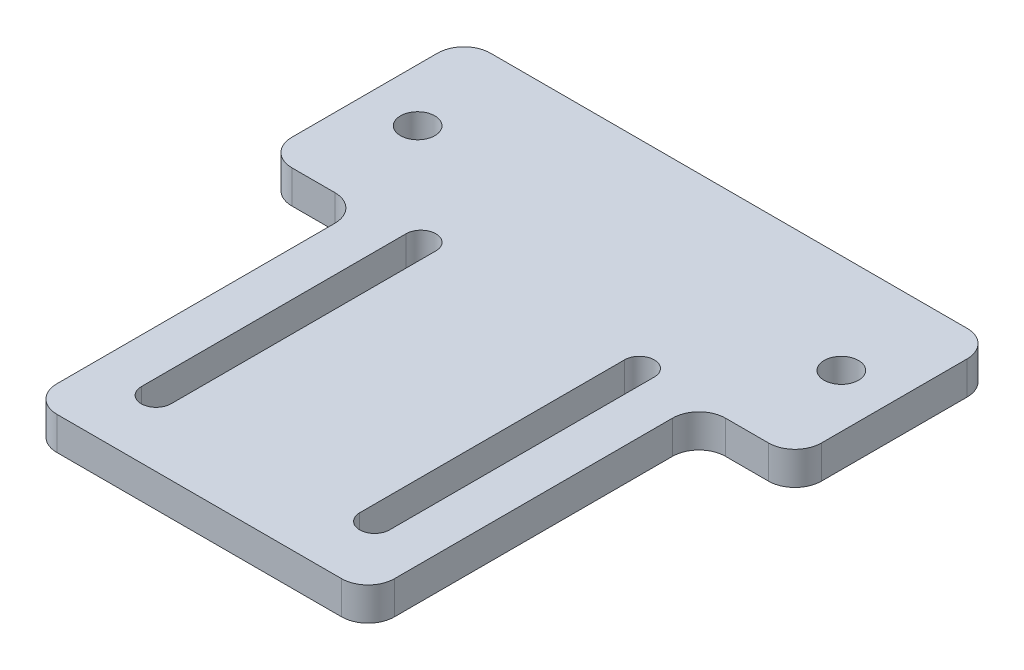
ISO-10303-21;
HEADER;
FILE_DESCRIPTION(('STEP AP214'),'2;1');
FILE_NAME('part.step','',(''),(''),'','','');
FILE_SCHEMA(('AUTOMOTIVE_DESIGN { 1 0 10303 214 1 1 1 1 }'));
ENDSEC;
DATA;
#1=APPLICATION_CONTEXT('core data for automotive mechanical design processes');
#2=APPLICATION_PROTOCOL_DEFINITION('international standard','automotive_design',2000,#1);
#3=PRODUCT_CONTEXT('',#1,'mechanical');
#4=PRODUCT('Part','Part','',(#3));
#5=PRODUCT_RELATED_PRODUCT_CATEGORY('part','',(#4));
#6=PRODUCT_DEFINITION_FORMATION('','',#4);
#7=PRODUCT_DEFINITION_CONTEXT('part definition',#1,'design');
#8=PRODUCT_DEFINITION('design','',#6,#7);
#9=PRODUCT_DEFINITION_SHAPE('','',#8);
#10=(LENGTH_UNIT() NAMED_UNIT(*) SI_UNIT(.MILLI.,.METRE.));
#11=(NAMED_UNIT(*) PLANE_ANGLE_UNIT() SI_UNIT($,.RADIAN.));
#12=(NAMED_UNIT(*) SI_UNIT($,.STERADIAN.) SOLID_ANGLE_UNIT());
#13=UNCERTAINTY_MEASURE_WITH_UNIT(LENGTH_MEASURE(1.E-05),#10,'distance_accuracy_value','');
#14=(GEOMETRIC_REPRESENTATION_CONTEXT(3) GLOBAL_UNCERTAINTY_ASSIGNED_CONTEXT((#13)) GLOBAL_UNIT_ASSIGNED_CONTEXT((#10,
#11,#12)) REPRESENTATION_CONTEXT('',''));
#15=CARTESIAN_POINT('',(0.,0.,0.));
#16=DIRECTION('',(0.,0.,1.));
#17=DIRECTION('',(1.,0.,0.));
#18=AXIS2_PLACEMENT_3D('',#15,#16,#17);
#19=CARTESIAN_POINT('',(0.,5.,0.));
#20=DIRECTION('',(0.,-1.,0.));
#21=DIRECTION('',(0.,0.,-1.));
#22=AXIS2_PLACEMENT_3D('',#19,#20,#21);
#23=PLANE('',#22);
#24=CARTESIAN_POINT('',(16.5,5.,0.));
#25=DIRECTION('',(0.,1.,0.));
#26=DIRECTION('',(0.,0.,1.));
#27=AXIS2_PLACEMENT_3D('',#24,#25,#26);
#28=CIRCLE('',#27,2.25);
#29=CARTESIAN_POINT('',(18.75,5.,0.));
#30=VERTEX_POINT('',#29);
#31=CARTESIAN_POINT('',(14.25,5.,0.));
#32=VERTEX_POINT('',#31);
#33=EDGE_CURVE('E425',#30,#32,#28,.T.);
#34=ORIENTED_EDGE('',*,*,#33,.F.);
#35=DIRECTION('',(0.,0.,-1.));
#36=VECTOR('',#35,1.);
#37=CARTESIAN_POINT('',(18.75,5.,0.));
#38=LINE('',#37,#36);
#39=CARTESIAN_POINT('',(18.75,5.,40.));
#40=VERTEX_POINT('',#39);
#41=EDGE_CURVE('E438',#40,#30,#38,.T.);
#42=ORIENTED_EDGE('',*,*,#41,.F.);
#43=CARTESIAN_POINT('',(16.5,5.,40.));
#44=DIRECTION('',(0.,1.,0.));
#45=DIRECTION('',(0.,0.,1.));
#46=AXIS2_PLACEMENT_3D('',#43,#44,#45);
#47=CIRCLE('',#46,2.24999999999999);
#48=CARTESIAN_POINT('',(14.25,5.,40.));
#49=VERTEX_POINT('',#48);
#50=EDGE_CURVE('E443',#49,#40,#47,.T.);
#51=ORIENTED_EDGE('',*,*,#50,.F.);
#52=DIRECTION('',(0.,0.,1.));
#53=VECTOR('',#52,1.);
#54=CARTESIAN_POINT('',(14.25,5.,0.));
#55=LINE('',#54,#53);
#56=EDGE_CURVE('E429',#32,#49,#55,.T.);
#57=ORIENTED_EDGE('',*,*,#56,.F.);
#58=EDGE_LOOP('',(#34,#42,#51,#57));
#59=FACE_BOUND('',#58,.T.);
#60=DIRECTION('',(-1.,0.,0.));
#61=VECTOR('',#60,1.);
#62=CARTESIAN_POINT('',(-40.,5.,-30.));
#63=LINE('',#62,#61);
#64=CARTESIAN_POINT('',(36.,5.,-30.));
#65=VERTEX_POINT('',#64);
#66=CARTESIAN_POINT('',(-36.,5.,-30.));
#67=VERTEX_POINT('',#66);
#68=EDGE_CURVE('E470',#65,#67,#63,.T.);
#69=ORIENTED_EDGE('',*,*,#68,.T.);
#70=CARTESIAN_POINT('',(-36.,5.,-26.));
#71=DIRECTION('',(0.,-1.,0.));
#72=DIRECTION('',(0.,0.,-1.));
#73=AXIS2_PLACEMENT_3D('',#70,#71,#72);
#74=CIRCLE('',#73,4.);
#75=CARTESIAN_POINT('',(-40.,5.,-26.));
#76=VERTEX_POINT('',#75);
#77=EDGE_CURVE('E529',#67,#76,#74,.F.);
#78=ORIENTED_EDGE('',*,*,#77,.T.);
#79=DIRECTION('',(0.,0.,1.));
#80=VECTOR('',#79,1.);
#81=CARTESIAN_POINT('',(-40.,5.,0.));
#82=LINE('',#81,#80);
#83=CARTESIAN_POINT('',(-40.,5.,-4.));
#84=VERTEX_POINT('',#83);
#85=EDGE_CURVE('E383',#76,#84,#82,.T.);
#86=ORIENTED_EDGE('',*,*,#85,.T.);
#87=CARTESIAN_POINT('',(-36.,5.,-4.));
#88=DIRECTION('',(0.,-1.,0.));
#89=DIRECTION('',(0.,0.,-1.));
#90=AXIS2_PLACEMENT_3D('',#87,#88,#89);
#91=CIRCLE('',#90,4.);
#92=CARTESIAN_POINT('',(-36.,5.,0.));
#93=VERTEX_POINT('',#92);
#94=EDGE_CURVE('E516',#84,#93,#91,.F.);
#95=ORIENTED_EDGE('',*,*,#94,.T.);
#96=DIRECTION('',(1.,0.,0.));
#97=VECTOR('',#96,1.);
#98=CARTESIAN_POINT('',(-40.,5.,0.));
#99=LINE('',#98,#97);
#100=CARTESIAN_POINT('',(-29.5,5.,0.));
#101=VERTEX_POINT('',#100);
#102=EDGE_CURVE('E369',#93,#101,#99,.T.);
#103=ORIENTED_EDGE('',*,*,#102,.T.);
#104=CARTESIAN_POINT('',(-29.5,5.,4.));
#105=DIRECTION('',(0.,-1.,0.));
#106=DIRECTION('',(0.,0.,-1.));
#107=AXIS2_PLACEMENT_3D('',#104,#105,#106);
#108=CIRCLE('',#107,4.);
#109=CARTESIAN_POINT('',(-25.5,5.,4.));
#110=VERTEX_POINT('',#109);
#111=EDGE_CURVE('E12',#101,#110,#108,.T.);
#112=ORIENTED_EDGE('',*,*,#111,.T.);
#113=DIRECTION('',(0.,0.,1.));
#114=VECTOR('',#113,1.);
#115=CARTESIAN_POINT('',(-25.5,5.,0.));
#116=LINE('',#115,#114);
#117=CARTESIAN_POINT('',(-25.5,5.,46.));
#118=VERTEX_POINT('',#117);
#119=EDGE_CURVE('E366',#110,#118,#116,.T.);
#120=ORIENTED_EDGE('',*,*,#119,.T.);
#121=CARTESIAN_POINT('',(-21.5,5.,46.));
#122=DIRECTION('',(0.,-1.,0.));
#123=DIRECTION('',(0.,0.,-1.));
#124=AXIS2_PLACEMENT_3D('',#121,#122,#123);
#125=CIRCLE('',#124,4.);
#126=CARTESIAN_POINT('',(-21.5,5.,50.));
#127=VERTEX_POINT('',#126);
#128=EDGE_CURVE('E519',#118,#127,#125,.F.);
#129=ORIENTED_EDGE('',*,*,#128,.T.);
#130=DIRECTION('',(1.,0.,0.));
#131=VECTOR('',#130,1.);
#132=CARTESIAN_POINT('',(-25.5,5.,50.));
#133=LINE('',#132,#131);
#134=CARTESIAN_POINT('',(21.5,5.,50.));
#135=VERTEX_POINT('',#134);
#136=EDGE_CURVE('E375',#127,#135,#133,.T.);
#137=ORIENTED_EDGE('',*,*,#136,.T.);
#138=CARTESIAN_POINT('',(21.5,5.,46.));
#139=DIRECTION('',(0.,-1.,0.));
#140=DIRECTION('',(0.,0.,-1.));
#141=AXIS2_PLACEMENT_3D('',#138,#139,#140);
#142=CIRCLE('',#141,4.);
#143=CARTESIAN_POINT('',(25.5,5.,46.));
#144=VERTEX_POINT('',#143);
#145=EDGE_CURVE('E521',#135,#144,#142,.F.);
#146=ORIENTED_EDGE('',*,*,#145,.T.);
#147=DIRECTION('',(0.,0.,-1.));
#148=VECTOR('',#147,1.);
#149=CARTESIAN_POINT('',(25.5,5.,50.));
#150=LINE('',#149,#148);
#151=CARTESIAN_POINT('',(25.5,5.,4.));
#152=VERTEX_POINT('',#151);
#153=EDGE_CURVE('E380',#144,#152,#150,.T.);
#154=ORIENTED_EDGE('',*,*,#153,.T.);
#155=CARTESIAN_POINT('',(29.5,5.,4.));
#156=DIRECTION('',(0.,-1.,0.));
#157=DIRECTION('',(0.,0.,-1.));
#158=AXIS2_PLACEMENT_3D('',#155,#156,#157);
#159=CIRCLE('',#158,4.);
#160=CARTESIAN_POINT('',(29.5,5.,0.));
#161=VERTEX_POINT('',#160);
#162=EDGE_CURVE('E558',#152,#161,#159,.T.);
#163=ORIENTED_EDGE('',*,*,#162,.T.);
#164=DIRECTION('',(1.,0.,0.));
#165=VECTOR('',#164,1.);
#166=CARTESIAN_POINT('',(25.5,5.,0.));
#167=LINE('',#166,#165);
#168=CARTESIAN_POINT('',(36.,5.,0.));
#169=VERTEX_POINT('',#168);
#170=EDGE_CURVE('E402',#161,#169,#167,.T.);
#171=ORIENTED_EDGE('',*,*,#170,.T.);
#172=CARTESIAN_POINT('',(36.,5.,-4.));
#173=DIRECTION('',(0.,-1.,0.));
#174=DIRECTION('',(0.,0.,-1.));
#175=AXIS2_PLACEMENT_3D('',#172,#173,#174);
#176=CIRCLE('',#175,4.);
#177=CARTESIAN_POINT('',(40.,5.,-4.));
#178=VERTEX_POINT('',#177);
#179=EDGE_CURVE('E70',#169,#178,#176,.F.);
#180=ORIENTED_EDGE('',*,*,#179,.T.);
#181=DIRECTION('',(0.,0.,-1.));
#182=VECTOR('',#181,1.);
#183=CARTESIAN_POINT('',(40.,5.,-30.));
#184=LINE('',#183,#182);
#185=CARTESIAN_POINT('',(40.,5.,-26.));
#186=VERTEX_POINT('',#185);
#187=EDGE_CURVE('E406',#178,#186,#184,.T.);
#188=ORIENTED_EDGE('',*,*,#187,.T.);
#189=CARTESIAN_POINT('',(36.,5.,-26.));
#190=DIRECTION('',(0.,-1.,0.));
#191=DIRECTION('',(0.,0.,-1.));
#192=AXIS2_PLACEMENT_3D('',#189,#190,#191);
#193=CIRCLE('',#192,4.);
#194=EDGE_CURVE('E526',#186,#65,#193,.F.);
#195=ORIENTED_EDGE('',*,*,#194,.T.);
#196=EDGE_LOOP('',(#69,#78,#86,#95,#103,#112,#120,#129,#137,#146,#154,#163,#171,#180,#188,#195));
#197=FACE_BOUND('',#196,.T.);
#198=CARTESIAN_POINT('',(-16.5,5.,0.));
#199=DIRECTION('',(0.,1.,0.));
#200=DIRECTION('',(0.,0.,-1.));
#201=AXIS2_PLACEMENT_3D('',#198,#199,#200);
#202=CIRCLE('',#201,2.25);
#203=CARTESIAN_POINT('',(-14.25,5.,0.));
#204=VERTEX_POINT('',#203);
#205=CARTESIAN_POINT('',(-18.75,5.,0.));
#206=VERTEX_POINT('',#205);
#207=EDGE_CURVE('E211',#204,#206,#202,.T.);
#208=ORIENTED_EDGE('',*,*,#207,.F.);
#209=DIRECTION('',(0.,0.,-1.));
#210=VECTOR('',#209,1.);
#211=CARTESIAN_POINT('',(-14.25,5.,0.));
#212=LINE('',#211,#210);
#213=CARTESIAN_POINT('',(-14.25,5.,40.));
#214=VERTEX_POINT('',#213);
#215=EDGE_CURVE('E241',#214,#204,#212,.T.);
#216=ORIENTED_EDGE('',*,*,#215,.F.);
#217=CARTESIAN_POINT('',(-16.5,5.,40.));
#218=DIRECTION('',(0.,1.,0.));
#219=DIRECTION('',(0.,0.,-1.));
#220=AXIS2_PLACEMENT_3D('',#217,#218,#219);
#221=CIRCLE('',#220,2.24999999999999);
#222=CARTESIAN_POINT('',(-18.75,5.,40.));
#223=VERTEX_POINT('',#222);
#224=EDGE_CURVE('E236',#223,#214,#221,.T.);
#225=ORIENTED_EDGE('',*,*,#224,.F.);
#226=DIRECTION('',(0.,0.,1.));
#227=VECTOR('',#226,1.);
#228=CARTESIAN_POINT('',(-18.75,5.,0.));
#229=LINE('',#228,#227);
#230=EDGE_CURVE('E222',#206,#223,#229,.T.);
#231=ORIENTED_EDGE('',*,*,#230,.F.);
#232=EDGE_LOOP('',(#208,#216,#225,#231));
#233=FACE_BOUND('',#232,.T.);
#234=CARTESIAN_POINT('',(32.,5.,-15.));
#235=DIRECTION('',(0.,1.,0.));
#236=DIRECTION('',(0.,0.,-1.));
#237=AXIS2_PLACEMENT_3D('',#234,#235,#236);
#238=CIRCLE('',#237,2.6);
#239=CARTESIAN_POINT('',(32.,5.,-17.6));
#240=VERTEX_POINT('',#239);
#241=EDGE_CURVE('E252',#240,#240,#238,.T.);
#242=ORIENTED_EDGE('',*,*,#241,.F.);
#243=EDGE_LOOP('',(#242));
#244=FACE_BOUND('',#243,.T.);
#245=CARTESIAN_POINT('',(-32.,5.,-15.));
#246=DIRECTION('',(0.,1.,0.));
#247=DIRECTION('',(0.,0.,1.));
#248=AXIS2_PLACEMENT_3D('',#245,#246,#247);
#249=CIRCLE('',#248,2.6);
#250=CARTESIAN_POINT('',(-32.,5.,-12.4));
#251=VERTEX_POINT('',#250);
#252=EDGE_CURVE('E260',#251,#251,#249,.T.);
#253=ORIENTED_EDGE('',*,*,#252,.F.);
#254=EDGE_LOOP('',(#253));
#255=FACE_BOUND('',#254,.T.);
#256=ADVANCED_FACE('F46',(#59,#197,#233,#244,#255),#23,.F.);
#257=CARTESIAN_POINT('',(0.,0.,0.));
#258=DIRECTION('',(0.,-1.,0.));
#259=DIRECTION('',(0.,0.,-1.));
#260=AXIS2_PLACEMENT_3D('',#257,#258,#259);
#261=PLANE('',#260);
#262=CARTESIAN_POINT('',(32.,0.,-15.));
#263=DIRECTION('',(0.,1.,0.));
#264=DIRECTION('',(0.,0.,-1.));
#265=AXIS2_PLACEMENT_3D('',#262,#263,#264);
#266=CIRCLE('',#265,2.6);
#267=CARTESIAN_POINT('',(32.,0.,-17.6));
#268=VERTEX_POINT('',#267);
#269=EDGE_CURVE('E257',#268,#268,#266,.T.);
#270=ORIENTED_EDGE('',*,*,#269,.T.);
#271=EDGE_LOOP('',(#270));
#272=FACE_BOUND('',#271,.T.);
#273=DIRECTION('',(0.,0.,1.));
#274=VECTOR('',#273,1.);
#275=CARTESIAN_POINT('',(-40.,0.,0.));
#276=LINE('',#275,#274);
#277=CARTESIAN_POINT('',(-40.,0.,-26.));
#278=VERTEX_POINT('',#277);
#279=CARTESIAN_POINT('',(-40.,0.,-4.));
#280=VERTEX_POINT('',#279);
#281=EDGE_CURVE('E463',#278,#280,#276,.T.);
#282=ORIENTED_EDGE('',*,*,#281,.F.);
#283=CARTESIAN_POINT('',(-36.,0.,-26.));
#284=DIRECTION('',(0.,-1.,0.));
#285=DIRECTION('',(0.,0.,-1.));
#286=AXIS2_PLACEMENT_3D('',#283,#284,#285);
#287=CIRCLE('',#286,4.);
#288=CARTESIAN_POINT('',(-36.,0.,-30.));
#289=VERTEX_POINT('',#288);
#290=EDGE_CURVE('E509',#278,#289,#287,.T.);
#291=ORIENTED_EDGE('',*,*,#290,.T.);
#292=DIRECTION('',(-1.,0.,0.));
#293=VECTOR('',#292,1.);
#294=CARTESIAN_POINT('',(-40.,0.,-30.));
#295=LINE('',#294,#293);
#296=CARTESIAN_POINT('',(36.,0.,-30.));
#297=VERTEX_POINT('',#296);
#298=EDGE_CURVE('E467',#297,#289,#295,.T.);
#299=ORIENTED_EDGE('',*,*,#298,.F.);
#300=CARTESIAN_POINT('',(36.,0.,-26.));
#301=DIRECTION('',(0.,-1.,0.));
#302=DIRECTION('',(0.,0.,-1.));
#303=AXIS2_PLACEMENT_3D('',#300,#301,#302);
#304=CIRCLE('',#303,4.);
#305=CARTESIAN_POINT('',(40.,0.,-26.));
#306=VERTEX_POINT('',#305);
#307=EDGE_CURVE('E507',#297,#306,#304,.T.);
#308=ORIENTED_EDGE('',*,*,#307,.T.);
#309=DIRECTION('',(0.,0.,-1.));
#310=VECTOR('',#309,1.);
#311=CARTESIAN_POINT('',(40.,0.,-30.));
#312=LINE('',#311,#310);
#313=CARTESIAN_POINT('',(40.,0.,-4.));
#314=VERTEX_POINT('',#313);
#315=EDGE_CURVE('E491',#314,#306,#312,.T.);
#316=ORIENTED_EDGE('',*,*,#315,.F.);
#317=CARTESIAN_POINT('',(36.,0.,-4.));
#318=DIRECTION('',(0.,-1.,0.));
#319=DIRECTION('',(0.,0.,-1.));
#320=AXIS2_PLACEMENT_3D('',#317,#318,#319);
#321=CIRCLE('',#320,4.);
#322=CARTESIAN_POINT('',(36.,0.,0.));
#323=VERTEX_POINT('',#322);
#324=EDGE_CURVE('E505',#314,#323,#321,.T.);
#325=ORIENTED_EDGE('',*,*,#324,.T.);
#326=DIRECTION('',(1.,0.,0.));
#327=VECTOR('',#326,1.);
#328=CARTESIAN_POINT('',(25.5,0.,0.));
#329=LINE('',#328,#327);
#330=CARTESIAN_POINT('',(29.5,0.,0.));
#331=VERTEX_POINT('',#330);
#332=EDGE_CURVE('E488',#331,#323,#329,.T.);
#333=ORIENTED_EDGE('',*,*,#332,.F.);
#334=CARTESIAN_POINT('',(29.5,0.,4.));
#335=DIRECTION('',(0.,-1.,0.));
#336=DIRECTION('',(0.,0.,-1.));
#337=AXIS2_PLACEMENT_3D('',#334,#335,#336);
#338=CIRCLE('',#337,4.);
#339=CARTESIAN_POINT('',(25.5,0.,4.));
#340=VERTEX_POINT('',#339);
#341=EDGE_CURVE('E557',#331,#340,#338,.F.);
#342=ORIENTED_EDGE('',*,*,#341,.T.);
#343=DIRECTION('',(0.,0.,-1.));
#344=VECTOR('',#343,1.);
#345=CARTESIAN_POINT('',(25.5,0.,50.));
#346=LINE('',#345,#344);
#347=CARTESIAN_POINT('',(25.5,0.,46.));
#348=VERTEX_POINT('',#347);
#349=EDGE_CURVE('E485',#348,#340,#346,.T.);
#350=ORIENTED_EDGE('',*,*,#349,.F.);
#351=CARTESIAN_POINT('',(21.5,0.,46.));
#352=DIRECTION('',(0.,-1.,0.));
#353=DIRECTION('',(0.,0.,-1.));
#354=AXIS2_PLACEMENT_3D('',#351,#352,#353);
#355=CIRCLE('',#354,4.);
#356=CARTESIAN_POINT('',(21.5,0.,50.));
#357=VERTEX_POINT('',#356);
#358=EDGE_CURVE('E503',#348,#357,#355,.T.);
#359=ORIENTED_EDGE('',*,*,#358,.T.);
#360=DIRECTION('',(1.,0.,0.));
#361=VECTOR('',#360,1.);
#362=CARTESIAN_POINT('',(-25.5,0.,50.));
#363=LINE('',#362,#361);
#364=CARTESIAN_POINT('',(-21.5,0.,50.));
#365=VERTEX_POINT('',#364);
#366=EDGE_CURVE('E482',#365,#357,#363,.T.);
#367=ORIENTED_EDGE('',*,*,#366,.F.);
#368=CARTESIAN_POINT('',(-21.5,0.,46.));
#369=DIRECTION('',(0.,-1.,0.));
#370=DIRECTION('',(0.,0.,-1.));
#371=AXIS2_PLACEMENT_3D('',#368,#369,#370);
#372=CIRCLE('',#371,4.);
#373=CARTESIAN_POINT('',(-25.5,0.,46.));
#374=VERTEX_POINT('',#373);
#375=EDGE_CURVE('E501',#365,#374,#372,.T.);
#376=ORIENTED_EDGE('',*,*,#375,.T.);
#377=DIRECTION('',(0.,0.,1.));
#378=VECTOR('',#377,1.);
#379=CARTESIAN_POINT('',(-25.5,0.,0.));
#380=LINE('',#379,#378);
#381=CARTESIAN_POINT('',(-25.5,0.,4.));
#382=VERTEX_POINT('',#381);
#383=EDGE_CURVE('E480',#382,#374,#380,.T.);
#384=ORIENTED_EDGE('',*,*,#383,.F.);
#385=CARTESIAN_POINT('',(-29.5,0.,4.));
#386=DIRECTION('',(0.,-1.,0.));
#387=DIRECTION('',(0.,0.,-1.));
#388=AXIS2_PLACEMENT_3D('',#385,#386,#387);
#389=CIRCLE('',#388,4.);
#390=CARTESIAN_POINT('',(-29.5,0.,0.));
#391=VERTEX_POINT('',#390);
#392=EDGE_CURVE('E56',#382,#391,#389,.F.);
#393=ORIENTED_EDGE('',*,*,#392,.T.);
#394=DIRECTION('',(1.,0.,0.));
#395=VECTOR('',#394,1.);
#396=CARTESIAN_POINT('',(-40.,0.,0.));
#397=LINE('',#396,#395);
#398=CARTESIAN_POINT('',(-36.,0.,0.));
#399=VERTEX_POINT('',#398);
#400=EDGE_CURVE('E477',#399,#391,#397,.T.);
#401=ORIENTED_EDGE('',*,*,#400,.F.);
#402=CARTESIAN_POINT('',(-36.,0.,-4.));
#403=DIRECTION('',(0.,-1.,0.));
#404=DIRECTION('',(0.,0.,-1.));
#405=AXIS2_PLACEMENT_3D('',#402,#403,#404);
#406=CIRCLE('',#405,4.);
#407=EDGE_CURVE('E499',#399,#280,#406,.T.);
#408=ORIENTED_EDGE('',*,*,#407,.T.);
#409=EDGE_LOOP('',(#282,#291,#299,#308,#316,#325,#333,#342,#350,#359,#367,#376,#384,#393,#401,#408));
#410=FACE_BOUND('',#409,.T.);
#411=DIRECTION('',(0.,0.,-1.));
#412=VECTOR('',#411,1.);
#413=CARTESIAN_POINT('',(18.75,0.,0.));
#414=LINE('',#413,#412);
#415=CARTESIAN_POINT('',(18.75,0.,40.));
#416=VERTEX_POINT('',#415);
#417=CARTESIAN_POINT('',(18.75,0.,0.));
#418=VERTEX_POINT('',#417);
#419=EDGE_CURVE('E430',#416,#418,#414,.T.);
#420=ORIENTED_EDGE('',*,*,#419,.T.);
#421=CARTESIAN_POINT('',(16.5,0.,0.));
#422=DIRECTION('',(0.,1.,0.));
#423=DIRECTION('',(0.,0.,1.));
#424=AXIS2_PLACEMENT_3D('',#421,#422,#423);
#425=CIRCLE('',#424,2.25);
#426=CARTESIAN_POINT('',(14.25,0.,0.));
#427=VERTEX_POINT('',#426);
#428=EDGE_CURVE('E230',#418,#427,#425,.T.);
#429=ORIENTED_EDGE('',*,*,#428,.T.);
#430=DIRECTION('',(0.,0.,1.));
#431=VECTOR('',#430,1.);
#432=CARTESIAN_POINT('',(14.25,0.,0.));
#433=LINE('',#432,#431);
#434=CARTESIAN_POINT('',(14.25,0.,40.));
#435=VERTEX_POINT('',#434);
#436=EDGE_CURVE('E447',#427,#435,#433,.T.);
#437=ORIENTED_EDGE('',*,*,#436,.T.);
#438=CARTESIAN_POINT('',(16.5,0.,40.));
#439=DIRECTION('',(0.,1.,0.));
#440=DIRECTION('',(0.,0.,1.));
#441=AXIS2_PLACEMENT_3D('',#438,#439,#440);
#442=CIRCLE('',#441,2.24999999999999);
#443=EDGE_CURVE('E450',#435,#416,#442,.T.);
#444=ORIENTED_EDGE('',*,*,#443,.T.);
#445=EDGE_LOOP('',(#420,#429,#437,#444));
#446=FACE_BOUND('',#445,.T.);
#447=DIRECTION('',(0.,0.,-1.));
#448=VECTOR('',#447,1.);
#449=CARTESIAN_POINT('',(-14.25,0.,0.));
#450=LINE('',#449,#448);
#451=CARTESIAN_POINT('',(-14.25,0.,40.));
#452=VERTEX_POINT('',#451);
#453=CARTESIAN_POINT('',(-14.25,0.,0.));
#454=VERTEX_POINT('',#453);
#455=EDGE_CURVE('E223',#452,#454,#450,.T.);
#456=ORIENTED_EDGE('',*,*,#455,.T.);
#457=CARTESIAN_POINT('',(-16.5,0.,0.));
#458=DIRECTION('',(0.,1.,0.));
#459=DIRECTION('',(0.,0.,-1.));
#460=AXIS2_PLACEMENT_3D('',#457,#458,#459);
#461=CIRCLE('',#460,2.25);
#462=CARTESIAN_POINT('',(-18.75,0.,0.));
#463=VERTEX_POINT('',#462);
#464=EDGE_CURVE('E256',#454,#463,#461,.T.);
#465=ORIENTED_EDGE('',*,*,#464,.T.);
#466=DIRECTION('',(0.,0.,1.));
#467=VECTOR('',#466,1.);
#468=CARTESIAN_POINT('',(-18.75,0.,0.));
#469=LINE('',#468,#467);
#470=CARTESIAN_POINT('',(-18.75,0.,40.));
#471=VERTEX_POINT('',#470);
#472=EDGE_CURVE('E229',#463,#471,#469,.T.);
#473=ORIENTED_EDGE('',*,*,#472,.T.);
#474=CARTESIAN_POINT('',(-16.5,0.,40.));
#475=DIRECTION('',(0.,1.,0.));
#476=DIRECTION('',(0.,0.,-1.));
#477=AXIS2_PLACEMENT_3D('',#474,#475,#476);
#478=CIRCLE('',#477,2.24999999999999);
#479=EDGE_CURVE('E416',#471,#452,#478,.T.);
#480=ORIENTED_EDGE('',*,*,#479,.T.);
#481=EDGE_LOOP('',(#456,#465,#473,#480));
#482=FACE_BOUND('',#481,.T.);
#483=CARTESIAN_POINT('',(-32.,0.,-15.));
#484=DIRECTION('',(0.,1.,0.));
#485=DIRECTION('',(0.,0.,1.));
#486=AXIS2_PLACEMENT_3D('',#483,#484,#485);
#487=CIRCLE('',#486,2.6);
#488=CARTESIAN_POINT('',(-32.,0.,-12.4));
#489=VERTEX_POINT('',#488);
#490=EDGE_CURVE('E258',#489,#489,#487,.T.);
#491=ORIENTED_EDGE('',*,*,#490,.T.);
#492=EDGE_LOOP('',(#491));
#493=FACE_BOUND('',#492,.T.);
#494=ADVANCED_FACE('F271',(#272,#410,#446,#482,#493),#261,.T.);
#495=CARTESIAN_POINT('',(-40.,5.,0.));
#496=DIRECTION('',(1.,0.,0.));
#497=DIRECTION('',(0.,0.,-1.));
#498=AXIS2_PLACEMENT_3D('',#495,#496,#497);
#499=PLANE('',#498);
#500=ORIENTED_EDGE('',*,*,#85,.F.);
#501=DIRECTION('',(0.,-1.,0.));
#502=VECTOR('',#501,1.);
#503=CARTESIAN_POINT('',(-40.,5.,-26.));
#504=LINE('',#503,#502);
#505=EDGE_CURVE('E496',#76,#278,#504,.T.);
#506=ORIENTED_EDGE('',*,*,#505,.T.);
#507=ORIENTED_EDGE('',*,*,#281,.T.);
#508=DIRECTION('',(0.,-1.,0.));
#509=VECTOR('',#508,1.);
#510=CARTESIAN_POINT('',(-40.,5.,-4.));
#511=LINE('',#510,#509);
#512=EDGE_CURVE('E474',#280,#84,#511,.F.);
#513=ORIENTED_EDGE('',*,*,#512,.T.);
#514=EDGE_LOOP('',(#500,#506,#507,#513));
#515=FACE_BOUND('',#514,.T.);
#516=ADVANCED_FACE('F294',(#515),#499,.F.);
#517=CARTESIAN_POINT('',(-40.,5.,0.));
#518=DIRECTION('',(0.,0.,-1.));
#519=DIRECTION('',(-1.,0.,0.));
#520=AXIS2_PLACEMENT_3D('',#517,#518,#519);
#521=PLANE('',#520);
#522=ORIENTED_EDGE('',*,*,#400,.T.);
#523=DIRECTION('',(0.,-1.,0.));
#524=VECTOR('',#523,1.);
#525=CARTESIAN_POINT('',(-29.5,5.,0.));
#526=LINE('',#525,#524);
#527=EDGE_CURVE('E359',#391,#101,#526,.F.);
#528=ORIENTED_EDGE('',*,*,#527,.T.);
#529=ORIENTED_EDGE('',*,*,#102,.F.);
#530=DIRECTION('',(0.,-1.,0.));
#531=VECTOR('',#530,1.);
#532=CARTESIAN_POINT('',(-36.,5.,0.));
#533=LINE('',#532,#531);
#534=EDGE_CURVE('E553',#93,#399,#533,.T.);
#535=ORIENTED_EDGE('',*,*,#534,.T.);
#536=EDGE_LOOP('',(#522,#528,#529,#535));
#537=FACE_BOUND('',#536,.T.);
#538=ADVANCED_FACE('F323',(#537),#521,.F.);
#539=CARTESIAN_POINT('',(-25.5,5.,0.));
#540=DIRECTION('',(1.,0.,0.));
#541=DIRECTION('',(0.,0.,-1.));
#542=AXIS2_PLACEMENT_3D('',#539,#540,#541);
#543=PLANE('',#542);
#544=ORIENTED_EDGE('',*,*,#383,.T.);
#545=DIRECTION('',(0.,-1.,0.));
#546=VECTOR('',#545,1.);
#547=CARTESIAN_POINT('',(-25.5,5.,46.));
#548=LINE('',#547,#546);
#549=EDGE_CURVE('E373',#374,#118,#548,.F.);
#550=ORIENTED_EDGE('',*,*,#549,.T.);
#551=ORIENTED_EDGE('',*,*,#119,.F.);
#552=DIRECTION('',(0.,-1.,0.));
#553=VECTOR('',#552,1.);
#554=CARTESIAN_POINT('',(-25.5,0.,4.));
#555=LINE('',#554,#553);
#556=EDGE_CURVE('E361',#110,#382,#555,.T.);
#557=ORIENTED_EDGE('',*,*,#556,.T.);
#558=EDGE_LOOP('',(#544,#550,#551,#557));
#559=FACE_BOUND('',#558,.T.);
#560=ADVANCED_FACE('F319',(#559),#543,.F.);
#561=CARTESIAN_POINT('',(-25.5,5.,50.));
#562=DIRECTION('',(0.,0.,-1.));
#563=DIRECTION('',(-1.,0.,0.));
#564=AXIS2_PLACEMENT_3D('',#561,#562,#563);
#565=PLANE('',#564);
#566=ORIENTED_EDGE('',*,*,#366,.T.);
#567=DIRECTION('',(0.,-1.,0.));
#568=VECTOR('',#567,1.);
#569=CARTESIAN_POINT('',(21.5,5.,50.));
#570=LINE('',#569,#568);
#571=EDGE_CURVE('E549',#357,#135,#570,.F.);
#572=ORIENTED_EDGE('',*,*,#571,.T.);
#573=ORIENTED_EDGE('',*,*,#136,.F.);
#574=DIRECTION('',(0.,-1.,0.));
#575=VECTOR('',#574,1.);
#576=CARTESIAN_POINT('',(-21.5,5.,50.));
#577=LINE('',#576,#575);
#578=EDGE_CURVE('E546',#127,#365,#577,.T.);
#579=ORIENTED_EDGE('',*,*,#578,.T.);
#580=EDGE_LOOP('',(#566,#572,#573,#579));
#581=FACE_BOUND('',#580,.T.);
#582=ADVANCED_FACE('F315',(#581),#565,.F.);
#583=CARTESIAN_POINT('',(25.5,5.,50.));
#584=DIRECTION('',(-1.,0.,0.));
#585=DIRECTION('',(0.,0.,1.));
#586=AXIS2_PLACEMENT_3D('',#583,#584,#585);
#587=PLANE('',#586);
#588=ORIENTED_EDGE('',*,*,#349,.T.);
#589=DIRECTION('',(0.,-1.,0.));
#590=VECTOR('',#589,1.);
#591=CARTESIAN_POINT('',(25.5,5.,4.));
#592=LINE('',#591,#590);
#593=EDGE_CURVE('E544',#340,#152,#592,.F.);
#594=ORIENTED_EDGE('',*,*,#593,.T.);
#595=ORIENTED_EDGE('',*,*,#153,.F.);
#596=DIRECTION('',(0.,-1.,0.));
#597=VECTOR('',#596,1.);
#598=CARTESIAN_POINT('',(25.5,5.,46.));
#599=LINE('',#598,#597);
#600=EDGE_CURVE('E541',#144,#348,#599,.T.);
#601=ORIENTED_EDGE('',*,*,#600,.T.);
#602=EDGE_LOOP('',(#588,#594,#595,#601));
#603=FACE_BOUND('',#602,.T.);
#604=ADVANCED_FACE('F311',(#603),#587,.F.);
#605=CARTESIAN_POINT('',(25.5,5.,0.));
#606=DIRECTION('',(0.,0.,-1.));
#607=DIRECTION('',(-1.,0.,0.));
#608=AXIS2_PLACEMENT_3D('',#605,#606,#607);
#609=PLANE('',#608);
#610=ORIENTED_EDGE('',*,*,#332,.T.);
#611=DIRECTION('',(0.,-1.,0.));
#612=VECTOR('',#611,1.);
#613=CARTESIAN_POINT('',(36.,5.,0.));
#614=LINE('',#613,#612);
#615=EDGE_CURVE('E539',#323,#169,#614,.F.);
#616=ORIENTED_EDGE('',*,*,#615,.T.);
#617=ORIENTED_EDGE('',*,*,#170,.F.);
#618=DIRECTION('',(0.,-1.,0.));
#619=VECTOR('',#618,1.);
#620=CARTESIAN_POINT('',(29.5,0.,0.));
#621=LINE('',#620,#619);
#622=EDGE_CURVE('E536',#161,#331,#621,.T.);
#623=ORIENTED_EDGE('',*,*,#622,.T.);
#624=EDGE_LOOP('',(#610,#616,#617,#623));
#625=FACE_BOUND('',#624,.T.);
#626=ADVANCED_FACE('F308',(#625),#609,.F.);
#627=CARTESIAN_POINT('',(40.,5.,-30.));
#628=DIRECTION('',(-1.,0.,0.));
#629=DIRECTION('',(0.,0.,1.));
#630=AXIS2_PLACEMENT_3D('',#627,#628,#629);
#631=PLANE('',#630);
#632=ORIENTED_EDGE('',*,*,#315,.T.);
#633=DIRECTION('',(0.,-1.,0.));
#634=VECTOR('',#633,1.);
#635=CARTESIAN_POINT('',(40.,5.,-26.));
#636=LINE('',#635,#634);
#637=EDGE_CURVE('E63',#306,#186,#636,.F.);
#638=ORIENTED_EDGE('',*,*,#637,.T.);
#639=ORIENTED_EDGE('',*,*,#187,.F.);
#640=DIRECTION('',(0.,-1.,0.));
#641=VECTOR('',#640,1.);
#642=CARTESIAN_POINT('',(40.,5.,-4.));
#643=LINE('',#642,#641);
#644=EDGE_CURVE('E532',#178,#314,#643,.T.);
#645=ORIENTED_EDGE('',*,*,#644,.T.);
#646=EDGE_LOOP('',(#632,#638,#639,#645));
#647=FACE_BOUND('',#646,.T.);
#648=ADVANCED_FACE('F304',(#647),#631,.F.);
#649=CARTESIAN_POINT('',(-40.,5.,-30.));
#650=DIRECTION('',(0.,0.,1.));
#651=DIRECTION('',(1.,0.,0.));
#652=AXIS2_PLACEMENT_3D('',#649,#650,#651);
#653=PLANE('',#652);
#654=ORIENTED_EDGE('',*,*,#298,.T.);
#655=DIRECTION('',(0.,-1.,0.));
#656=VECTOR('',#655,1.);
#657=CARTESIAN_POINT('',(-36.,5.,-30.));
#658=LINE('',#657,#656);
#659=EDGE_CURVE('E514',#289,#67,#658,.F.);
#660=ORIENTED_EDGE('',*,*,#659,.T.);
#661=ORIENTED_EDGE('',*,*,#68,.F.);
#662=DIRECTION('',(0.,-1.,0.));
#663=VECTOR('',#662,1.);
#664=CARTESIAN_POINT('',(36.,5.,-30.));
#665=LINE('',#664,#663);
#666=EDGE_CURVE('E511',#65,#297,#665,.T.);
#667=ORIENTED_EDGE('',*,*,#666,.T.);
#668=EDGE_LOOP('',(#654,#660,#661,#667));
#669=FACE_BOUND('',#668,.T.);
#670=ADVANCED_FACE('F301',(#669),#653,.F.);
#671=CARTESIAN_POINT('',(16.5,5.,0.));
#672=DIRECTION('',(0.,-1.,0.));
#673=DIRECTION('',(0.,0.,-1.));
#674=AXIS2_PLACEMENT_3D('',#671,#672,#673);
#675=CYLINDRICAL_SURFACE('',#674,2.25);
#676=ORIENTED_EDGE('',*,*,#428,.F.);
#677=DIRECTION('',(0.,-1.,0.));
#678=VECTOR('',#677,1.);
#679=CARTESIAN_POINT('',(18.75,5.,0.));
#680=LINE('',#679,#678);
#681=EDGE_CURVE('E442',#30,#418,#680,.T.);
#682=ORIENTED_EDGE('',*,*,#681,.F.);
#683=ORIENTED_EDGE('',*,*,#33,.T.);
#684=DIRECTION('',(0.,-1.,0.));
#685=VECTOR('',#684,1.);
#686=CARTESIAN_POINT('',(14.25,5.,0.));
#687=LINE('',#686,#685);
#688=EDGE_CURVE('E461',#32,#427,#687,.T.);
#689=ORIENTED_EDGE('',*,*,#688,.T.);
#690=EDGE_LOOP('',(#676,#682,#683,#689));
#691=FACE_BOUND('',#690,.T.);
#692=ADVANCED_FACE('F298',(#691),#675,.F.);
#693=CARTESIAN_POINT('',(14.25,5.,0.));
#694=DIRECTION('',(1.,0.,0.));
#695=DIRECTION('',(0.,0.,-1.));
#696=AXIS2_PLACEMENT_3D('',#693,#694,#695);
#697=PLANE('',#696);
#698=ORIENTED_EDGE('',*,*,#436,.F.);
#699=ORIENTED_EDGE('',*,*,#688,.F.);
#700=ORIENTED_EDGE('',*,*,#56,.T.);
#701=DIRECTION('',(0.,-1.,0.));
#702=VECTOR('',#701,1.);
#703=CARTESIAN_POINT('',(14.25,5.,40.));
#704=LINE('',#703,#702);
#705=EDGE_CURVE('E459',#49,#435,#704,.T.);
#706=ORIENTED_EDGE('',*,*,#705,.T.);
#707=EDGE_LOOP('',(#698,#699,#700,#706));
#708=FACE_BOUND('',#707,.T.);
#709=ADVANCED_FACE('F617',(#708),#697,.T.);
#710=CARTESIAN_POINT('',(16.5,5.,40.));
#711=DIRECTION('',(0.,-1.,0.));
#712=DIRECTION('',(0.,0.,-1.));
#713=AXIS2_PLACEMENT_3D('',#710,#711,#712);
#714=CYLINDRICAL_SURFACE('',#713,2.24999999999999);
#715=ORIENTED_EDGE('',*,*,#443,.F.);
#716=ORIENTED_EDGE('',*,*,#705,.F.);
#717=ORIENTED_EDGE('',*,*,#50,.T.);
#718=DIRECTION('',(0.,-1.,0.));
#719=VECTOR('',#718,1.);
#720=CARTESIAN_POINT('',(18.75,5.,40.));
#721=LINE('',#720,#719);
#722=EDGE_CURVE('E457',#40,#416,#721,.T.);
#723=ORIENTED_EDGE('',*,*,#722,.T.);
#724=EDGE_LOOP('',(#715,#716,#717,#723));
#725=FACE_BOUND('',#724,.T.);
#726=ADVANCED_FACE('F614',(#725),#714,.F.);
#727=CARTESIAN_POINT('',(18.75,5.,0.));
#728=DIRECTION('',(-1.,0.,0.));
#729=DIRECTION('',(0.,0.,1.));
#730=AXIS2_PLACEMENT_3D('',#727,#728,#729);
#731=PLANE('',#730);
#732=ORIENTED_EDGE('',*,*,#419,.F.);
#733=ORIENTED_EDGE('',*,*,#722,.F.);
#734=ORIENTED_EDGE('',*,*,#41,.T.);
#735=ORIENTED_EDGE('',*,*,#681,.T.);
#736=EDGE_LOOP('',(#732,#733,#734,#735));
#737=FACE_BOUND('',#736,.T.);
#738=ADVANCED_FACE('F611',(#737),#731,.T.);
#739=CARTESIAN_POINT('',(-16.5,5.,0.));
#740=DIRECTION('',(0.,-1.,0.));
#741=DIRECTION('',(0.,0.,-1.));
#742=AXIS2_PLACEMENT_3D('',#739,#740,#741);
#743=CYLINDRICAL_SURFACE('',#742,2.25);
#744=ORIENTED_EDGE('',*,*,#464,.F.);
#745=DIRECTION('',(0.,-1.,0.));
#746=VECTOR('',#745,1.);
#747=CARTESIAN_POINT('',(-14.25,5.,0.));
#748=LINE('',#747,#746);
#749=EDGE_CURVE('E217',#204,#454,#748,.T.);
#750=ORIENTED_EDGE('',*,*,#749,.F.);
#751=ORIENTED_EDGE('',*,*,#207,.T.);
#752=DIRECTION('',(0.,-1.,0.));
#753=VECTOR('',#752,1.);
#754=CARTESIAN_POINT('',(-18.75,5.,0.));
#755=LINE('',#754,#753);
#756=EDGE_CURVE('E214',#206,#463,#755,.T.);
#757=ORIENTED_EDGE('',*,*,#756,.T.);
#758=EDGE_LOOP('',(#744,#750,#751,#757));
#759=FACE_BOUND('',#758,.T.);
#760=ADVANCED_FACE('F213',(#759),#743,.F.);
#761=CARTESIAN_POINT('',(-18.75,5.,0.));
#762=DIRECTION('',(1.,0.,0.));
#763=DIRECTION('',(0.,0.,-1.));
#764=AXIS2_PLACEMENT_3D('',#761,#762,#763);
#765=PLANE('',#764);
#766=ORIENTED_EDGE('',*,*,#472,.F.);
#767=ORIENTED_EDGE('',*,*,#756,.F.);
#768=ORIENTED_EDGE('',*,*,#230,.T.);
#769=DIRECTION('',(0.,-1.,0.));
#770=VECTOR('',#769,1.);
#771=CARTESIAN_POINT('',(-18.75,5.,40.));
#772=LINE('',#771,#770);
#773=EDGE_CURVE('E231',#223,#471,#772,.T.);
#774=ORIENTED_EDGE('',*,*,#773,.T.);
#775=EDGE_LOOP('',(#766,#767,#768,#774));
#776=FACE_BOUND('',#775,.T.);
#777=ADVANCED_FACE('F226',(#776),#765,.T.);
#778=CARTESIAN_POINT('',(-16.5,5.,40.));
#779=DIRECTION('',(0.,-1.,0.));
#780=DIRECTION('',(0.,0.,-1.));
#781=AXIS2_PLACEMENT_3D('',#778,#779,#780);
#782=CYLINDRICAL_SURFACE('',#781,2.24999999999999);
#783=ORIENTED_EDGE('',*,*,#479,.F.);
#784=ORIENTED_EDGE('',*,*,#773,.F.);
#785=ORIENTED_EDGE('',*,*,#224,.T.);
#786=DIRECTION('',(0.,-1.,0.));
#787=VECTOR('',#786,1.);
#788=CARTESIAN_POINT('',(-14.25,5.,40.));
#789=LINE('',#788,#787);
#790=EDGE_CURVE('E422',#214,#452,#789,.T.);
#791=ORIENTED_EDGE('',*,*,#790,.T.);
#792=EDGE_LOOP('',(#783,#784,#785,#791));
#793=FACE_BOUND('',#792,.T.);
#794=ADVANCED_FACE('F599',(#793),#782,.F.);
#795=CARTESIAN_POINT('',(-14.25,5.,0.));
#796=DIRECTION('',(-1.,0.,0.));
#797=DIRECTION('',(0.,0.,1.));
#798=AXIS2_PLACEMENT_3D('',#795,#796,#797);
#799=PLANE('',#798);
#800=ORIENTED_EDGE('',*,*,#455,.F.);
#801=ORIENTED_EDGE('',*,*,#790,.F.);
#802=ORIENTED_EDGE('',*,*,#215,.T.);
#803=ORIENTED_EDGE('',*,*,#749,.T.);
#804=EDGE_LOOP('',(#800,#801,#802,#803));
#805=FACE_BOUND('',#804,.T.);
#806=ADVANCED_FACE('F286',(#805),#799,.T.);
#807=CARTESIAN_POINT('',(32.,5.,-15.));
#808=DIRECTION('',(0.,-1.,0.));
#809=DIRECTION('',(0.,0.,-1.));
#810=AXIS2_PLACEMENT_3D('',#807,#808,#809);
#811=CYLINDRICAL_SURFACE('',#810,2.6);
#812=ORIENTED_EDGE('',*,*,#241,.T.);
#813=EDGE_LOOP('',(#812));
#814=FACE_BOUND('',#813,.T.);
#815=ORIENTED_EDGE('',*,*,#269,.F.);
#816=EDGE_LOOP('',(#815));
#817=FACE_BOUND('',#816,.T.);
#818=ADVANCED_FACE('F276',(#814,#817),#811,.F.);
#819=CARTESIAN_POINT('',(-32.,5.,-15.));
#820=DIRECTION('',(0.,-1.,0.));
#821=DIRECTION('',(0.,0.,-1.));
#822=AXIS2_PLACEMENT_3D('',#819,#820,#821);
#823=CYLINDRICAL_SURFACE('',#822,2.6);
#824=ORIENTED_EDGE('',*,*,#252,.T.);
#825=EDGE_LOOP('',(#824));
#826=FACE_BOUND('',#825,.T.);
#827=ORIENTED_EDGE('',*,*,#490,.F.);
#828=EDGE_LOOP('',(#827));
#829=FACE_BOUND('',#828,.T.);
#830=ADVANCED_FACE('F273',(#826,#829),#823,.F.);
#831=CARTESIAN_POINT('',(-36.,5.,-26.));
#832=DIRECTION('',(0.,-1.,0.));
#833=DIRECTION('',(0.,0.,-1.));
#834=AXIS2_PLACEMENT_3D('',#831,#832,#833);
#835=CYLINDRICAL_SURFACE('',#834,4.);
#836=ORIENTED_EDGE('',*,*,#77,.F.);
#837=ORIENTED_EDGE('',*,*,#659,.F.);
#838=ORIENTED_EDGE('',*,*,#290,.F.);
#839=ORIENTED_EDGE('',*,*,#505,.F.);
#840=EDGE_LOOP('',(#836,#837,#838,#839));
#841=FACE_BOUND('',#840,.T.);
#842=ADVANCED_FACE('F275',(#841),#835,.T.);
#843=CARTESIAN_POINT('',(36.,5.,-26.));
#844=DIRECTION('',(0.,-1.,0.));
#845=DIRECTION('',(0.,0.,-1.));
#846=AXIS2_PLACEMENT_3D('',#843,#844,#845);
#847=CYLINDRICAL_SURFACE('',#846,4.);
#848=ORIENTED_EDGE('',*,*,#194,.F.);
#849=ORIENTED_EDGE('',*,*,#637,.F.);
#850=ORIENTED_EDGE('',*,*,#307,.F.);
#851=ORIENTED_EDGE('',*,*,#666,.F.);
#852=EDGE_LOOP('',(#848,#849,#850,#851));
#853=FACE_BOUND('',#852,.T.);
#854=ADVANCED_FACE('F283',(#853),#847,.T.);
#855=CARTESIAN_POINT('',(36.,5.,-4.));
#856=DIRECTION('',(0.,-1.,0.));
#857=DIRECTION('',(0.,0.,-1.));
#858=AXIS2_PLACEMENT_3D('',#855,#856,#857);
#859=CYLINDRICAL_SURFACE('',#858,4.);
#860=ORIENTED_EDGE('',*,*,#179,.F.);
#861=ORIENTED_EDGE('',*,*,#615,.F.);
#862=ORIENTED_EDGE('',*,*,#324,.F.);
#863=ORIENTED_EDGE('',*,*,#644,.F.);
#864=EDGE_LOOP('',(#860,#861,#862,#863));
#865=FACE_BOUND('',#864,.T.);
#866=ADVANCED_FACE('F333',(#865),#859,.T.);
#867=CARTESIAN_POINT('',(29.5,5.,4.));
#868=DIRECTION('',(0.,1.,0.));
#869=DIRECTION('',(0.,0.,1.));
#870=AXIS2_PLACEMENT_3D('',#867,#868,#869);
#871=CYLINDRICAL_SURFACE('',#870,4.);
#872=ORIENTED_EDGE('',*,*,#162,.F.);
#873=ORIENTED_EDGE('',*,*,#593,.F.);
#874=ORIENTED_EDGE('',*,*,#341,.F.);
#875=ORIENTED_EDGE('',*,*,#622,.F.);
#876=EDGE_LOOP('',(#872,#873,#874,#875));
#877=FACE_BOUND('',#876,.T.);
#878=ADVANCED_FACE('F337',(#877),#871,.F.);
#879=CARTESIAN_POINT('',(21.5,5.,46.));
#880=DIRECTION('',(0.,-1.,0.));
#881=DIRECTION('',(0.,0.,-1.));
#882=AXIS2_PLACEMENT_3D('',#879,#880,#881);
#883=CYLINDRICAL_SURFACE('',#882,4.);
#884=ORIENTED_EDGE('',*,*,#145,.F.);
#885=ORIENTED_EDGE('',*,*,#571,.F.);
#886=ORIENTED_EDGE('',*,*,#358,.F.);
#887=ORIENTED_EDGE('',*,*,#600,.F.);
#888=EDGE_LOOP('',(#884,#885,#886,#887));
#889=FACE_BOUND('',#888,.T.);
#890=ADVANCED_FACE('F341',(#889),#883,.T.);
#891=CARTESIAN_POINT('',(-21.5,5.,46.));
#892=DIRECTION('',(0.,-1.,0.));
#893=DIRECTION('',(0.,0.,-1.));
#894=AXIS2_PLACEMENT_3D('',#891,#892,#893);
#895=CYLINDRICAL_SURFACE('',#894,4.);
#896=ORIENTED_EDGE('',*,*,#128,.F.);
#897=ORIENTED_EDGE('',*,*,#549,.F.);
#898=ORIENTED_EDGE('',*,*,#375,.F.);
#899=ORIENTED_EDGE('',*,*,#578,.F.);
#900=EDGE_LOOP('',(#896,#897,#898,#899));
#901=FACE_BOUND('',#900,.T.);
#902=ADVANCED_FACE('F345',(#901),#895,.T.);
#903=CARTESIAN_POINT('',(-29.5,5.,4.));
#904=DIRECTION('',(0.,1.,0.));
#905=DIRECTION('',(0.,0.,1.));
#906=AXIS2_PLACEMENT_3D('',#903,#904,#905);
#907=CYLINDRICAL_SURFACE('',#906,4.);
#908=ORIENTED_EDGE('',*,*,#111,.F.);
#909=ORIENTED_EDGE('',*,*,#527,.F.);
#910=ORIENTED_EDGE('',*,*,#392,.F.);
#911=ORIENTED_EDGE('',*,*,#556,.F.);
#912=EDGE_LOOP('',(#908,#909,#910,#911));
#913=FACE_BOUND('',#912,.T.);
#914=ADVANCED_FACE('F348',(#913),#907,.F.);
#915=CARTESIAN_POINT('',(-36.,5.,-4.));
#916=DIRECTION('',(0.,-1.,0.));
#917=DIRECTION('',(0.,0.,-1.));
#918=AXIS2_PLACEMENT_3D('',#915,#916,#917);
#919=CYLINDRICAL_SURFACE('',#918,4.);
#920=ORIENTED_EDGE('',*,*,#94,.F.);
#921=ORIENTED_EDGE('',*,*,#512,.F.);
#922=ORIENTED_EDGE('',*,*,#407,.F.);
#923=ORIENTED_EDGE('',*,*,#534,.F.);
#924=EDGE_LOOP('',(#920,#921,#922,#923));
#925=FACE_BOUND('',#924,.T.);
#926=ADVANCED_FACE('F48',(#925),#919,.T.);
#927=CLOSED_SHELL('',(#256,#494,#516,#538,#560,#582,#604,#626,#648,#670,#692,#709,#726,#738,
#760,#777,#794,#806,#818,#830,#842,#854,#866,#878,#890,#902,#914,#926));
#928=MANIFOLD_SOLID_BREP('B2',#927);
#929=ADVANCED_BREP_SHAPE_REPRESENTATION('',(#18,#928),#14);
#930=SHAPE_DEFINITION_REPRESENTATION(#9,#929);
ENDSEC;
END-ISO-10303-21;
